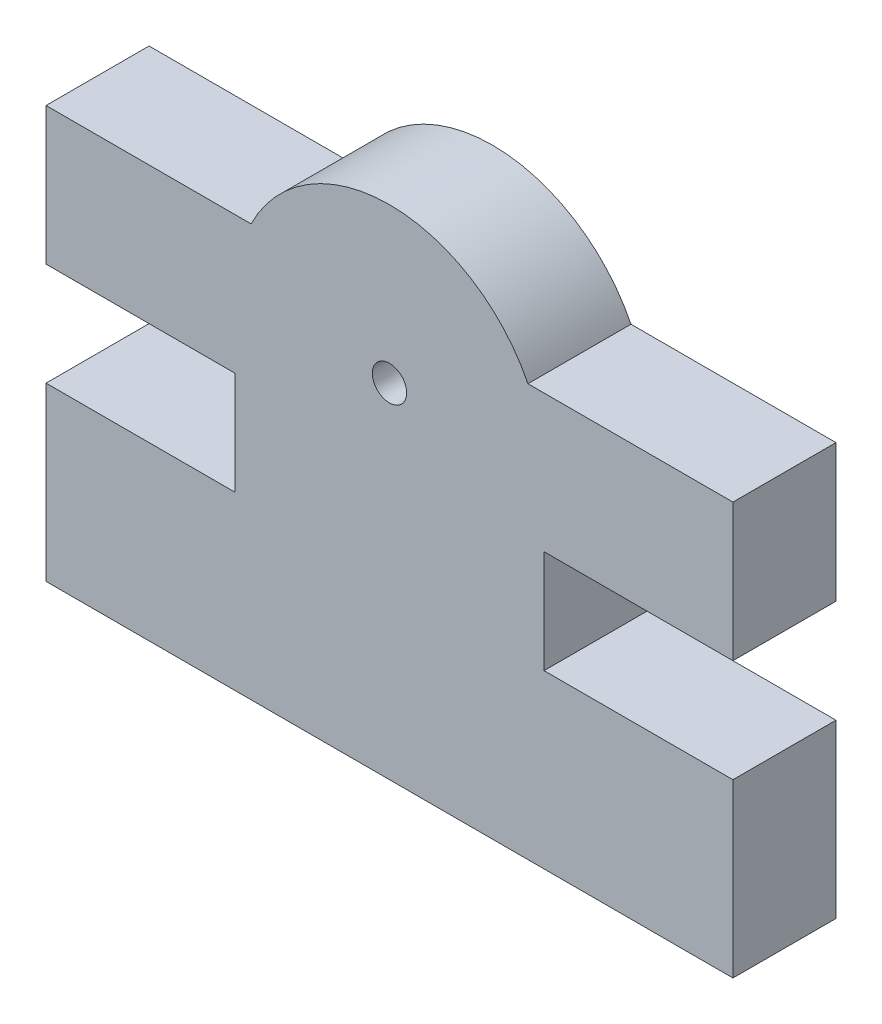
ISO-10303-21;
HEADER;
FILE_DESCRIPTION(('STEP AP214'),'2;1');
FILE_NAME('part.step','',(''),(''),'','','');
FILE_SCHEMA(('AUTOMOTIVE_DESIGN { 1 0 10303 214 1 1 1 1 }'));
ENDSEC;
DATA;
#1=APPLICATION_CONTEXT('core data for automotive mechanical design processes');
#2=APPLICATION_PROTOCOL_DEFINITION('international standard','automotive_design',2000,#1);
#3=PRODUCT_CONTEXT('',#1,'mechanical');
#4=PRODUCT('Part','Part','',(#3));
#5=PRODUCT_RELATED_PRODUCT_CATEGORY('part','',(#4));
#6=PRODUCT_DEFINITION_FORMATION('','',#4);
#7=PRODUCT_DEFINITION_CONTEXT('part definition',#1,'design');
#8=PRODUCT_DEFINITION('design','',#6,#7);
#9=PRODUCT_DEFINITION_SHAPE('','',#8);
#10=(LENGTH_UNIT() NAMED_UNIT(*) SI_UNIT(.MILLI.,.METRE.));
#11=(NAMED_UNIT(*) PLANE_ANGLE_UNIT() SI_UNIT($,.RADIAN.));
#12=(NAMED_UNIT(*) SI_UNIT($,.STERADIAN.) SOLID_ANGLE_UNIT());
#13=UNCERTAINTY_MEASURE_WITH_UNIT(LENGTH_MEASURE(1.E-05),#10,'distance_accuracy_value','');
#14=(GEOMETRIC_REPRESENTATION_CONTEXT(3) GLOBAL_UNCERTAINTY_ASSIGNED_CONTEXT((#13)) GLOBAL_UNIT_ASSIGNED_CONTEXT((#10,
#11,#12)) REPRESENTATION_CONTEXT('',''));
#15=CARTESIAN_POINT('',(0.,0.,0.));
#16=DIRECTION('',(0.,0.,1.));
#17=DIRECTION('',(1.,0.,0.));
#18=AXIS2_PLACEMENT_3D('',#15,#16,#17);
#19=CARTESIAN_POINT('',(4.5,4.99999994187292,3.));
#20=DIRECTION('',(0.,0.,1.));
#21=DIRECTION('',(1.,0.,0.));
#22=AXIS2_PLACEMENT_3D('',#19,#20,#21);
#23=PLANE('',#22);
#24=DIRECTION('',(0.,-1.,0.));
#25=VECTOR('',#24,1.);
#26=CARTESIAN_POINT('',(0.,0.,3.));
#27=LINE('',#26,#25);
#28=CARTESIAN_POINT('',(0.,3.,3.));
#29=VERTEX_POINT('',#28);
#30=CARTESIAN_POINT('',(0.,0.,3.));
#31=VERTEX_POINT('',#30);
#32=EDGE_CURVE('E97',#29,#31,#27,.T.);
#33=ORIENTED_EDGE('',*,*,#32,.T.);
#34=DIRECTION('',(-1.,0.,0.));
#35=VECTOR('',#34,1.);
#36=CARTESIAN_POINT('',(-5.5,0.,3.));
#37=LINE('',#36,#35);
#38=CARTESIAN_POINT('',(-5.5,0.,3.));
#39=VERTEX_POINT('',#38);
#40=EDGE_CURVE('E203',#31,#39,#37,.T.);
#41=ORIENTED_EDGE('',*,*,#40,.T.);
#42=DIRECTION('',(0.,1.,0.));
#43=VECTOR('',#42,1.);
#44=CARTESIAN_POINT('',(-5.5,-5.,3.));
#45=LINE('',#44,#43);
#46=CARTESIAN_POINT('',(-5.5,-5.,3.));
#47=VERTEX_POINT('',#46);
#48=EDGE_CURVE('E255',#47,#39,#45,.T.);
#49=ORIENTED_EDGE('',*,*,#48,.F.);
#50=DIRECTION('',(-1.,0.,0.));
#51=VECTOR('',#50,1.);
#52=CARTESIAN_POINT('',(-5.5,-5.,3.));
#53=LINE('',#52,#51);
#54=CARTESIAN_POINT('',(14.5,-5.,3.));
#55=VERTEX_POINT('',#54);
#56=EDGE_CURVE('E239',#55,#47,#53,.T.);
#57=ORIENTED_EDGE('',*,*,#56,.F.);
#58=DIRECTION('',(0.,1.,0.));
#59=VECTOR('',#58,1.);
#60=CARTESIAN_POINT('',(14.5,-5.,3.));
#61=LINE('',#60,#59);
#62=CARTESIAN_POINT('',(14.5,0.,3.));
#63=VERTEX_POINT('',#62);
#64=EDGE_CURVE('E200',#55,#63,#61,.T.);
#65=ORIENTED_EDGE('',*,*,#64,.T.);
#66=CARTESIAN_POINT('',(9.,0.,3.));
#67=VERTEX_POINT('',#66);
#68=EDGE_CURVE('E269',#63,#67,#37,.T.);
#69=ORIENTED_EDGE('',*,*,#68,.T.);
#70=DIRECTION('',(0.,1.,0.));
#71=VECTOR('',#70,1.);
#72=CARTESIAN_POINT('',(9.,0.,3.));
#73=LINE('',#72,#71);
#74=CARTESIAN_POINT('',(9.,3.,3.));
#75=VERTEX_POINT('',#74);
#76=EDGE_CURVE('E180',#67,#75,#73,.T.);
#77=ORIENTED_EDGE('',*,*,#76,.T.);
#78=DIRECTION('',(1.,0.,0.));
#79=VECTOR('',#78,1.);
#80=CARTESIAN_POINT('',(14.5,3.,3.));
#81=LINE('',#80,#79);
#82=CARTESIAN_POINT('',(14.5,3.,3.));
#83=VERTEX_POINT('',#82);
#84=EDGE_CURVE('E182',#75,#83,#81,.T.);
#85=ORIENTED_EDGE('',*,*,#84,.T.);
#86=DIRECTION('',(0.,1.,0.));
#87=VECTOR('',#86,1.);
#88=CARTESIAN_POINT('',(14.5,6.99999988374584,3.));
#89=LINE('',#88,#87);
#90=CARTESIAN_POINT('',(14.5,6.99999988374584,3.));
#91=VERTEX_POINT('',#90);
#92=EDGE_CURVE('E208',#83,#91,#89,.T.);
#93=ORIENTED_EDGE('',*,*,#92,.T.);
#94=DIRECTION('',(-1.,0.,0.));
#95=VECTOR('',#94,1.);
#96=CARTESIAN_POINT('',(14.5,6.99999988374584,3.));
#97=LINE('',#96,#95);
#98=CARTESIAN_POINT('',(8.53112890298838,6.99999988374584,3.));
#99=VERTEX_POINT('',#98);
#100=EDGE_CURVE('E210',#91,#99,#97,.T.);
#101=ORIENTED_EDGE('',*,*,#100,.T.);
#102=CARTESIAN_POINT('',(4.5,4.99999994187292,3.));
#103=DIRECTION('',(0.,0.,1.));
#104=DIRECTION('',(1.,0.,0.));
#105=AXIS2_PLACEMENT_3D('',#102,#103,#104);
#106=CIRCLE('',#105,4.5);
#107=CARTESIAN_POINT('',(0.468871097011618,6.99999988374584,3.));
#108=VERTEX_POINT('',#107);
#109=EDGE_CURVE('E126',#99,#108,#106,.T.);
#110=ORIENTED_EDGE('',*,*,#109,.T.);
#111=DIRECTION('',(-1.,0.,0.));
#112=VECTOR('',#111,1.);
#113=CARTESIAN_POINT('',(0.468871097011618,6.99999988374584,3.));
#114=LINE('',#113,#112);
#115=CARTESIAN_POINT('',(-5.5,6.99999988374584,3.));
#116=VERTEX_POINT('',#115);
#117=EDGE_CURVE('E120',#108,#116,#114,.T.);
#118=ORIENTED_EDGE('',*,*,#117,.T.);
#119=DIRECTION('',(0.,-1.,0.));
#120=VECTOR('',#119,1.);
#121=CARTESIAN_POINT('',(-5.5,6.99999988374584,3.));
#122=LINE('',#121,#120);
#123=CARTESIAN_POINT('',(-5.5,3.,3.));
#124=VERTEX_POINT('',#123);
#125=EDGE_CURVE('E124',#116,#124,#122,.T.);
#126=ORIENTED_EDGE('',*,*,#125,.T.);
#127=DIRECTION('',(1.,0.,0.));
#128=VECTOR('',#127,1.);
#129=CARTESIAN_POINT('',(0.,3.,3.));
#130=LINE('',#129,#128);
#131=EDGE_CURVE('E52',#124,#29,#130,.T.);
#132=ORIENTED_EDGE('',*,*,#131,.T.);
#133=EDGE_LOOP('',(#33,#41,#49,#57,#65,#69,#77,#85,#93,#101,#110,#118,#126,#132));
#134=FACE_BOUND('',#133,.T.);
#135=CARTESIAN_POINT('',(4.5,4.99999994187292,3.));
#136=DIRECTION('',(0.,0.,1.));
#137=DIRECTION('',(1.,0.,0.));
#138=AXIS2_PLACEMENT_3D('',#135,#136,#137);
#139=CIRCLE('',#138,0.5);
#140=CARTESIAN_POINT('',(5.,4.99999994187292,3.));
#141=VERTEX_POINT('',#140);
#142=EDGE_CURVE('E189',#141,#141,#139,.T.);
#143=ORIENTED_EDGE('',*,*,#142,.F.);
#144=EDGE_LOOP('',(#143));
#145=FACE_BOUND('',#144,.T.);
#146=ADVANCED_FACE('F33',(#134,#145),#23,.T.);
#147=CARTESIAN_POINT('',(4.5,4.99999994187292,0.));
#148=DIRECTION('',(0.,0.,1.));
#149=DIRECTION('',(1.,0.,0.));
#150=AXIS2_PLACEMENT_3D('',#147,#148,#149);
#151=PLANE('',#150);
#152=DIRECTION('',(0.,-1.,0.));
#153=VECTOR('',#152,1.);
#154=CARTESIAN_POINT('',(0.,0.,0.));
#155=LINE('',#154,#153);
#156=CARTESIAN_POINT('',(0.,3.,0.));
#157=VERTEX_POINT('',#156);
#158=CARTESIAN_POINT('',(0.,0.,0.));
#159=VERTEX_POINT('',#158);
#160=EDGE_CURVE('E184',#157,#159,#155,.T.);
#161=ORIENTED_EDGE('',*,*,#160,.F.);
#162=DIRECTION('',(1.,0.,0.));
#163=VECTOR('',#162,1.);
#164=CARTESIAN_POINT('',(0.,3.,0.));
#165=LINE('',#164,#163);
#166=CARTESIAN_POINT('',(-5.5,3.,0.));
#167=VERTEX_POINT('',#166);
#168=EDGE_CURVE('E91',#167,#157,#165,.T.);
#169=ORIENTED_EDGE('',*,*,#168,.F.);
#170=DIRECTION('',(0.,-1.,0.));
#171=VECTOR('',#170,1.);
#172=CARTESIAN_POINT('',(-5.5,6.99999988374584,0.));
#173=LINE('',#172,#171);
#174=CARTESIAN_POINT('',(-5.5,6.99999988374584,0.));
#175=VERTEX_POINT('',#174);
#176=EDGE_CURVE('E85',#175,#167,#173,.T.);
#177=ORIENTED_EDGE('',*,*,#176,.F.);
#178=DIRECTION('',(-1.,0.,0.));
#179=VECTOR('',#178,1.);
#180=CARTESIAN_POINT('',(0.468871097011618,6.99999988374584,0.));
#181=LINE('',#180,#179);
#182=CARTESIAN_POINT('',(0.468871097011618,6.99999988374584,0.));
#183=VERTEX_POINT('',#182);
#184=EDGE_CURVE('E134',#183,#175,#181,.T.);
#185=ORIENTED_EDGE('',*,*,#184,.F.);
#186=CARTESIAN_POINT('',(4.5,4.99999994187292,0.));
#187=DIRECTION('',(0.,0.,1.));
#188=DIRECTION('',(1.,0.,0.));
#189=AXIS2_PLACEMENT_3D('',#186,#187,#188);
#190=CIRCLE('',#189,4.5);
#191=CARTESIAN_POINT('',(8.53112890298838,6.99999988374584,0.));
#192=VERTEX_POINT('',#191);
#193=EDGE_CURVE('E151',#192,#183,#190,.T.);
#194=ORIENTED_EDGE('',*,*,#193,.F.);
#195=DIRECTION('',(-1.,0.,0.));
#196=VECTOR('',#195,1.);
#197=CARTESIAN_POINT('',(14.5,6.99999988374584,0.));
#198=LINE('',#197,#196);
#199=CARTESIAN_POINT('',(14.5,6.99999988374584,0.));
#200=VERTEX_POINT('',#199);
#201=EDGE_CURVE('E149',#200,#192,#198,.T.);
#202=ORIENTED_EDGE('',*,*,#201,.F.);
#203=DIRECTION('',(0.,1.,0.));
#204=VECTOR('',#203,1.);
#205=CARTESIAN_POINT('',(14.5,6.99999988374584,0.));
#206=LINE('',#205,#204);
#207=CARTESIAN_POINT('',(14.5,3.,0.));
#208=VERTEX_POINT('',#207);
#209=EDGE_CURVE('E146',#208,#200,#206,.T.);
#210=ORIENTED_EDGE('',*,*,#209,.F.);
#211=DIRECTION('',(1.,0.,0.));
#212=VECTOR('',#211,1.);
#213=CARTESIAN_POINT('',(14.5,3.,0.));
#214=LINE('',#213,#212);
#215=CARTESIAN_POINT('',(9.,3.,0.));
#216=VERTEX_POINT('',#215);
#217=EDGE_CURVE('E144',#216,#208,#214,.T.);
#218=ORIENTED_EDGE('',*,*,#217,.F.);
#219=DIRECTION('',(0.,1.,0.));
#220=VECTOR('',#219,1.);
#221=CARTESIAN_POINT('',(9.,0.,0.));
#222=LINE('',#221,#220);
#223=CARTESIAN_POINT('',(9.,0.,0.));
#224=VERTEX_POINT('',#223);
#225=EDGE_CURVE('E147',#224,#216,#222,.T.);
#226=ORIENTED_EDGE('',*,*,#225,.F.);
#227=DIRECTION('',(1.,0.,0.));
#228=VECTOR('',#227,1.);
#229=CARTESIAN_POINT('',(-5.5,0.,0.));
#230=LINE('',#229,#228);
#231=CARTESIAN_POINT('',(14.5,0.,0.));
#232=VERTEX_POINT('',#231);
#233=EDGE_CURVE('E236',#224,#232,#230,.T.);
#234=ORIENTED_EDGE('',*,*,#233,.T.);
#235=DIRECTION('',(0.,1.,0.));
#236=VECTOR('',#235,1.);
#237=CARTESIAN_POINT('',(14.5,-5.,0.));
#238=LINE('',#237,#236);
#239=CARTESIAN_POINT('',(14.5,-5.,0.));
#240=VERTEX_POINT('',#239);
#241=EDGE_CURVE('E250',#240,#232,#238,.T.);
#242=ORIENTED_EDGE('',*,*,#241,.F.);
#243=DIRECTION('',(1.,0.,0.));
#244=VECTOR('',#243,1.);
#245=CARTESIAN_POINT('',(-5.5,-5.,0.));
#246=LINE('',#245,#244);
#247=CARTESIAN_POINT('',(-5.5,-5.,0.));
#248=VERTEX_POINT('',#247);
#249=EDGE_CURVE('E254',#248,#240,#246,.T.);
#250=ORIENTED_EDGE('',*,*,#249,.F.);
#251=DIRECTION('',(0.,1.,0.));
#252=VECTOR('',#251,1.);
#253=CARTESIAN_POINT('',(-5.5,-5.,0.));
#254=LINE('',#253,#252);
#255=CARTESIAN_POINT('',(-5.5,0.,0.));
#256=VERTEX_POINT('',#255);
#257=EDGE_CURVE('E231',#248,#256,#254,.T.);
#258=ORIENTED_EDGE('',*,*,#257,.T.);
#259=EDGE_CURVE('E227',#256,#159,#230,.T.);
#260=ORIENTED_EDGE('',*,*,#259,.T.);
#261=EDGE_LOOP('',(#161,#169,#177,#185,#194,#202,#210,#218,#226,#234,#242,#250,#258,#260));
#262=FACE_BOUND('',#261,.T.);
#263=CARTESIAN_POINT('',(4.5,4.99999994187292,0.));
#264=DIRECTION('',(0.,0.,1.));
#265=DIRECTION('',(1.,0.,0.));
#266=AXIS2_PLACEMENT_3D('',#263,#264,#265);
#267=CIRCLE('',#266,0.5);
#268=CARTESIAN_POINT('',(5.,4.99999994187292,0.));
#269=VERTEX_POINT('',#268);
#270=EDGE_CURVE('E193',#269,#269,#267,.T.);
#271=ORIENTED_EDGE('',*,*,#270,.T.);
#272=EDGE_LOOP('',(#271));
#273=FACE_BOUND('',#272,.T.);
#274=ADVANCED_FACE('F222',(#262,#273),#151,.F.);
#275=CARTESIAN_POINT('',(0.,0.,3.));
#276=DIRECTION('',(1.,0.,0.));
#277=DIRECTION('',(0.,1.,0.));
#278=AXIS2_PLACEMENT_3D('',#275,#276,#277);
#279=PLANE('',#278);
#280=ORIENTED_EDGE('',*,*,#160,.T.);
#281=DIRECTION('',(0.,0.,-1.));
#282=VECTOR('',#281,1.);
#283=CARTESIAN_POINT('',(0.,0.,3.));
#284=LINE('',#283,#282);
#285=EDGE_CURVE('E11',#31,#159,#284,.T.);
#286=ORIENTED_EDGE('',*,*,#285,.F.);
#287=ORIENTED_EDGE('',*,*,#32,.F.);
#288=DIRECTION('',(0.,0.,-1.));
#289=VECTOR('',#288,1.);
#290=CARTESIAN_POINT('',(0.,3.,3.));
#291=LINE('',#290,#289);
#292=EDGE_CURVE('E140',#29,#157,#291,.T.);
#293=ORIENTED_EDGE('',*,*,#292,.T.);
#294=EDGE_LOOP('',(#280,#286,#287,#293));
#295=FACE_BOUND('',#294,.T.);
#296=ADVANCED_FACE('F35',(#295),#279,.F.);
#297=CARTESIAN_POINT('',(9.,0.,3.));
#298=DIRECTION('',(-1.,0.,0.));
#299=DIRECTION('',(0.,0.,1.));
#300=AXIS2_PLACEMENT_3D('',#297,#298,#299);
#301=PLANE('',#300);
#302=ORIENTED_EDGE('',*,*,#225,.T.);
#303=DIRECTION('',(0.,0.,-1.));
#304=VECTOR('',#303,1.);
#305=CARTESIAN_POINT('',(9.,3.,3.));
#306=LINE('',#305,#304);
#307=EDGE_CURVE('E168',#75,#216,#306,.T.);
#308=ORIENTED_EDGE('',*,*,#307,.F.);
#309=ORIENTED_EDGE('',*,*,#76,.F.);
#310=DIRECTION('',(0.,0.,-1.));
#311=VECTOR('',#310,1.);
#312=CARTESIAN_POINT('',(9.,0.,3.));
#313=LINE('',#312,#311);
#314=EDGE_CURVE('E43',#67,#224,#313,.T.);
#315=ORIENTED_EDGE('',*,*,#314,.T.);
#316=EDGE_LOOP('',(#302,#308,#309,#315));
#317=FACE_BOUND('',#316,.T.);
#318=ADVANCED_FACE('F340',(#317),#301,.F.);
#319=CARTESIAN_POINT('',(14.5,3.,3.));
#320=DIRECTION('',(0.,1.,0.));
#321=DIRECTION('',(0.,0.,1.));
#322=AXIS2_PLACEMENT_3D('',#319,#320,#321);
#323=PLANE('',#322);
#324=ORIENTED_EDGE('',*,*,#217,.T.);
#325=DIRECTION('',(0.,0.,-1.));
#326=VECTOR('',#325,1.);
#327=CARTESIAN_POINT('',(14.5,3.,3.));
#328=LINE('',#327,#326);
#329=EDGE_CURVE('E165',#83,#208,#328,.T.);
#330=ORIENTED_EDGE('',*,*,#329,.F.);
#331=ORIENTED_EDGE('',*,*,#84,.F.);
#332=ORIENTED_EDGE('',*,*,#307,.T.);
#333=EDGE_LOOP('',(#324,#330,#331,#332));
#334=FACE_BOUND('',#333,.T.);
#335=ADVANCED_FACE('F337',(#334),#323,.F.);
#336=CARTESIAN_POINT('',(14.5,6.99999988374584,3.));
#337=DIRECTION('',(-1.,0.,0.));
#338=DIRECTION('',(0.,0.,1.));
#339=AXIS2_PLACEMENT_3D('',#336,#337,#338);
#340=PLANE('',#339);
#341=ORIENTED_EDGE('',*,*,#209,.T.);
#342=DIRECTION('',(0.,0.,-1.));
#343=VECTOR('',#342,1.);
#344=CARTESIAN_POINT('',(14.5,6.99999988374584,3.));
#345=LINE('',#344,#343);
#346=EDGE_CURVE('E162',#91,#200,#345,.T.);
#347=ORIENTED_EDGE('',*,*,#346,.F.);
#348=ORIENTED_EDGE('',*,*,#92,.F.);
#349=ORIENTED_EDGE('',*,*,#329,.T.);
#350=EDGE_LOOP('',(#341,#347,#348,#349));
#351=FACE_BOUND('',#350,.T.);
#352=ADVANCED_FACE('F334',(#351),#340,.F.);
#353=CARTESIAN_POINT('',(14.5,6.99999988374584,3.));
#354=DIRECTION('',(0.,-1.,0.));
#355=DIRECTION('',(0.,0.,-1.));
#356=AXIS2_PLACEMENT_3D('',#353,#354,#355);
#357=PLANE('',#356);
#358=ORIENTED_EDGE('',*,*,#201,.T.);
#359=DIRECTION('',(0.,0.,-1.));
#360=VECTOR('',#359,1.);
#361=CARTESIAN_POINT('',(8.53112890298838,6.99999988374584,3.));
#362=LINE('',#361,#360);
#363=EDGE_CURVE('E159',#99,#192,#362,.T.);
#364=ORIENTED_EDGE('',*,*,#363,.F.);
#365=ORIENTED_EDGE('',*,*,#100,.F.);
#366=ORIENTED_EDGE('',*,*,#346,.T.);
#367=EDGE_LOOP('',(#358,#364,#365,#366));
#368=FACE_BOUND('',#367,.T.);
#369=ADVANCED_FACE('F216',(#368),#357,.F.);
#370=CARTESIAN_POINT('',(4.5,4.99999994187292,3.));
#371=DIRECTION('',(0.,0.,-1.));
#372=DIRECTION('',(-1.,0.,0.));
#373=AXIS2_PLACEMENT_3D('',#370,#371,#372);
#374=CYLINDRICAL_SURFACE('',#373,4.5);
#375=ORIENTED_EDGE('',*,*,#193,.T.);
#376=DIRECTION('',(0.,0.,-1.));
#377=VECTOR('',#376,1.);
#378=CARTESIAN_POINT('',(0.468871097011618,6.99999988374584,3.));
#379=LINE('',#378,#377);
#380=EDGE_CURVE('E135',#108,#183,#379,.T.);
#381=ORIENTED_EDGE('',*,*,#380,.F.);
#382=ORIENTED_EDGE('',*,*,#109,.F.);
#383=ORIENTED_EDGE('',*,*,#363,.T.);
#384=EDGE_LOOP('',(#375,#381,#382,#383));
#385=FACE_BOUND('',#384,.T.);
#386=ADVANCED_FACE('F220',(#385),#374,.T.);
#387=CARTESIAN_POINT('',(0.468871097011618,6.99999988374584,3.));
#388=DIRECTION('',(0.,-1.,0.));
#389=DIRECTION('',(0.,0.,-1.));
#390=AXIS2_PLACEMENT_3D('',#387,#388,#389);
#391=PLANE('',#390);
#392=ORIENTED_EDGE('',*,*,#184,.T.);
#393=DIRECTION('',(0.,0.,-1.));
#394=VECTOR('',#393,1.);
#395=CARTESIAN_POINT('',(-5.5,6.99999988374584,3.));
#396=LINE('',#395,#394);
#397=EDGE_CURVE('E131',#116,#175,#396,.T.);
#398=ORIENTED_EDGE('',*,*,#397,.F.);
#399=ORIENTED_EDGE('',*,*,#117,.F.);
#400=ORIENTED_EDGE('',*,*,#380,.T.);
#401=EDGE_LOOP('',(#392,#398,#399,#400));
#402=FACE_BOUND('',#401,.T.);
#403=ADVANCED_FACE('F132',(#402),#391,.F.);
#404=CARTESIAN_POINT('',(-5.5,6.99999988374584,3.));
#405=DIRECTION('',(1.,0.,0.));
#406=DIRECTION('',(0.,0.,-1.));
#407=AXIS2_PLACEMENT_3D('',#404,#405,#406);
#408=PLANE('',#407);
#409=ORIENTED_EDGE('',*,*,#176,.T.);
#410=DIRECTION('',(0.,0.,-1.));
#411=VECTOR('',#410,1.);
#412=CARTESIAN_POINT('',(-5.5,3.,3.));
#413=LINE('',#412,#411);
#414=EDGE_CURVE('E136',#124,#167,#413,.T.);
#415=ORIENTED_EDGE('',*,*,#414,.F.);
#416=ORIENTED_EDGE('',*,*,#125,.F.);
#417=ORIENTED_EDGE('',*,*,#397,.T.);
#418=EDGE_LOOP('',(#409,#415,#416,#417));
#419=FACE_BOUND('',#418,.T.);
#420=ADVANCED_FACE('F138',(#419),#408,.F.);
#421=CARTESIAN_POINT('',(0.,3.,3.));
#422=DIRECTION('',(0.,1.,0.));
#423=DIRECTION('',(0.,0.,1.));
#424=AXIS2_PLACEMENT_3D('',#421,#422,#423);
#425=PLANE('',#424);
#426=ORIENTED_EDGE('',*,*,#168,.T.);
#427=ORIENTED_EDGE('',*,*,#292,.F.);
#428=ORIENTED_EDGE('',*,*,#131,.F.);
#429=ORIENTED_EDGE('',*,*,#414,.T.);
#430=EDGE_LOOP('',(#426,#427,#428,#429));
#431=FACE_BOUND('',#430,.T.);
#432=ADVANCED_FACE('F323',(#431),#425,.F.);
#433=CARTESIAN_POINT('',(4.5,4.99999994187292,3.));
#434=DIRECTION('',(0.,0.,-1.));
#435=DIRECTION('',(-1.,0.,0.));
#436=AXIS2_PLACEMENT_3D('',#433,#434,#435);
#437=CYLINDRICAL_SURFACE('',#436,0.5);
#438=ORIENTED_EDGE('',*,*,#142,.T.);
#439=EDGE_LOOP('',(#438));
#440=FACE_BOUND('',#439,.T.);
#441=ORIENTED_EDGE('',*,*,#270,.F.);
#442=EDGE_LOOP('',(#441));
#443=FACE_BOUND('',#442,.T.);
#444=ADVANCED_FACE('F320',(#440,#443),#437,.F.);
#445=CARTESIAN_POINT('',(0.,0.,0.));
#446=DIRECTION('',(0.,-1.,0.));
#447=DIRECTION('',(0.,0.,-1.));
#448=AXIS2_PLACEMENT_3D('',#445,#446,#447);
#449=PLANE('',#448);
#450=ORIENTED_EDGE('',*,*,#40,.F.);
#451=ORIENTED_EDGE('',*,*,#285,.T.);
#452=ORIENTED_EDGE('',*,*,#259,.F.);
#453=DIRECTION('',(0.,0.,-1.));
#454=VECTOR('',#453,1.);
#455=CARTESIAN_POINT('',(-5.5,0.,3.));
#456=LINE('',#455,#454);
#457=EDGE_CURVE('E242',#39,#256,#456,.T.);
#458=ORIENTED_EDGE('',*,*,#457,.F.);
#459=EDGE_LOOP('',(#450,#451,#452,#458));
#460=FACE_BOUND('',#459,.T.);
#461=ADVANCED_FACE('F291',(#460),#449,.F.);
#462=CARTESIAN_POINT('',(14.5,-5.,3.));
#463=DIRECTION('',(-1.,0.,0.));
#464=DIRECTION('',(0.,0.,1.));
#465=AXIS2_PLACEMENT_3D('',#462,#463,#464);
#466=PLANE('',#465);
#467=DIRECTION('',(0.,0.,1.));
#468=VECTOR('',#467,1.);
#469=CARTESIAN_POINT('',(14.5,0.,3.));
#470=LINE('',#469,#468);
#471=EDGE_CURVE('E276',#232,#63,#470,.T.);
#472=ORIENTED_EDGE('',*,*,#471,.T.);
#473=ORIENTED_EDGE('',*,*,#64,.F.);
#474=DIRECTION('',(0.,0.,1.));
#475=VECTOR('',#474,1.);
#476=CARTESIAN_POINT('',(14.5,-5.,3.));
#477=LINE('',#476,#475);
#478=EDGE_CURVE('E235',#240,#55,#477,.T.);
#479=ORIENTED_EDGE('',*,*,#478,.F.);
#480=ORIENTED_EDGE('',*,*,#241,.T.);
#481=EDGE_LOOP('',(#472,#473,#479,#480));
#482=FACE_BOUND('',#481,.T.);
#483=ADVANCED_FACE('F277',(#482),#466,.F.);
#484=CARTESIAN_POINT('',(-5.5,-5.,3.));
#485=DIRECTION('',(1.,0.,0.));
#486=DIRECTION('',(0.,0.,-1.));
#487=AXIS2_PLACEMENT_3D('',#484,#485,#486);
#488=PLANE('',#487);
#489=ORIENTED_EDGE('',*,*,#457,.T.);
#490=ORIENTED_EDGE('',*,*,#257,.F.);
#491=DIRECTION('',(0.,0.,-1.));
#492=VECTOR('',#491,1.);
#493=CARTESIAN_POINT('',(-5.5,-5.,3.));
#494=LINE('',#493,#492);
#495=EDGE_CURVE('E302',#47,#248,#494,.T.);
#496=ORIENTED_EDGE('',*,*,#495,.F.);
#497=ORIENTED_EDGE('',*,*,#48,.T.);
#498=EDGE_LOOP('',(#489,#490,#496,#497));
#499=FACE_BOUND('',#498,.T.);
#500=ADVANCED_FACE('F287',(#499),#488,.F.);
#501=CARTESIAN_POINT('',(0.,-5.,0.));
#502=DIRECTION('',(0.,-1.,0.));
#503=DIRECTION('',(0.,0.,-1.));
#504=AXIS2_PLACEMENT_3D('',#501,#502,#503);
#505=PLANE('',#504);
#506=ORIENTED_EDGE('',*,*,#478,.T.);
#507=ORIENTED_EDGE('',*,*,#56,.T.);
#508=ORIENTED_EDGE('',*,*,#495,.T.);
#509=ORIENTED_EDGE('',*,*,#249,.T.);
#510=EDGE_LOOP('',(#506,#507,#508,#509));
#511=FACE_BOUND('',#510,.T.);
#512=ADVANCED_FACE('F301',(#511),#505,.T.);
#513=ORIENTED_EDGE('',*,*,#314,.F.);
#514=ORIENTED_EDGE('',*,*,#68,.F.);
#515=ORIENTED_EDGE('',*,*,#471,.F.);
#516=ORIENTED_EDGE('',*,*,#233,.F.);
#517=EDGE_LOOP('',(#513,#514,#515,#516));
#518=FACE_BOUND('',#517,.T.);
#519=ADVANCED_FACE('F305',(#518),#449,.F.);
#520=CLOSED_SHELL('',(#146,#274,#296,#318,#335,#352,#369,#386,#403,#420,#432,#444,#461,#483,
#500,#512,#519));
#521=MANIFOLD_SOLID_BREP('B2',#520);
#522=ADVANCED_BREP_SHAPE_REPRESENTATION('',(#18,#521),#14);
#523=SHAPE_DEFINITION_REPRESENTATION(#9,#522);
ENDSEC;
END-ISO-10303-21;
